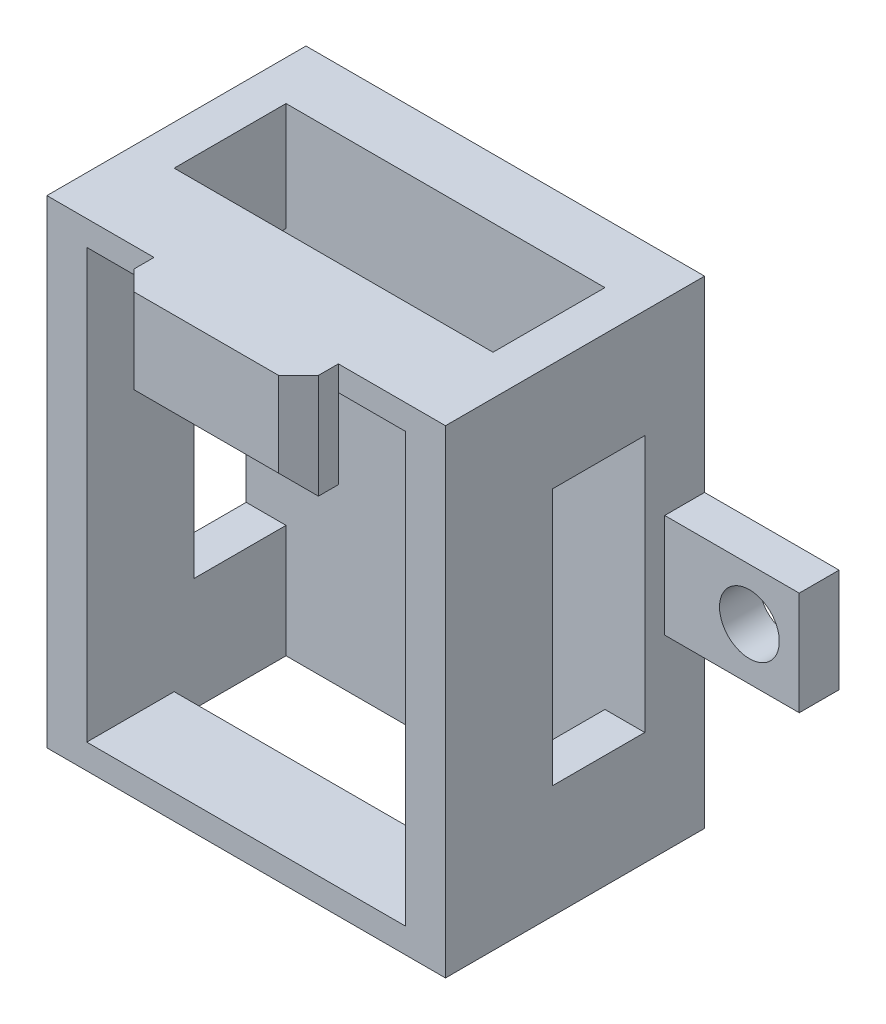
ISO-10303-21;
HEADER;
FILE_DESCRIPTION(('STEP AP214'),'2;1');
FILE_NAME('part.step','',(''),(''),'','','');
FILE_SCHEMA(('AUTOMOTIVE_DESIGN { 1 0 10303 214 1 1 1 1 }'));
ENDSEC;
DATA;
#1=APPLICATION_CONTEXT('core data for automotive mechanical design processes');
#2=APPLICATION_PROTOCOL_DEFINITION('international standard','automotive_design',2000,#1);
#3=PRODUCT_CONTEXT('',#1,'mechanical');
#4=PRODUCT('Part','Part','',(#3));
#5=PRODUCT_RELATED_PRODUCT_CATEGORY('part','',(#4));
#6=PRODUCT_DEFINITION_FORMATION('','',#4);
#7=PRODUCT_DEFINITION_CONTEXT('part definition',#1,'design');
#8=PRODUCT_DEFINITION('design','',#6,#7);
#9=PRODUCT_DEFINITION_SHAPE('','',#8);
#10=(LENGTH_UNIT() NAMED_UNIT(*) SI_UNIT(.MILLI.,.METRE.));
#11=(NAMED_UNIT(*) PLANE_ANGLE_UNIT() SI_UNIT($,.RADIAN.));
#12=(NAMED_UNIT(*) SI_UNIT($,.STERADIAN.) SOLID_ANGLE_UNIT());
#13=UNCERTAINTY_MEASURE_WITH_UNIT(LENGTH_MEASURE(1.E-05),#10,'distance_accuracy_value','');
#14=(GEOMETRIC_REPRESENTATION_CONTEXT(3) GLOBAL_UNCERTAINTY_ASSIGNED_CONTEXT((#13)) GLOBAL_UNIT_ASSIGNED_CONTEXT((#10,
#11,#12)) REPRESENTATION_CONTEXT('',''));
#15=CARTESIAN_POINT('',(0.,0.,0.));
#16=DIRECTION('',(0.,0.,1.));
#17=DIRECTION('',(1.,0.,0.));
#18=AXIS2_PLACEMENT_3D('',#15,#16,#17);
#19=CARTESIAN_POINT('',(10.,12.,3.));
#20=DIRECTION('',(-1.,0.,0.));
#21=DIRECTION('',(0.,-1.,0.));
#22=AXIS2_PLACEMENT_3D('',#19,#20,#21);
#23=PLANE('',#22);
#24=DIRECTION('',(0.,0.,-1.));
#25=VECTOR('',#24,1.);
#26=CARTESIAN_POINT('',(10.,-2.6,2.));
#27=LINE('',#26,#25);
#28=CARTESIAN_POINT('',(10.,-2.6,2.));
#29=VERTEX_POINT('',#28);
#30=CARTESIAN_POINT('',(10.,-2.6,0.));
#31=VERTEX_POINT('',#30);
#32=EDGE_CURVE('E434',#29,#31,#27,.T.);
#33=ORIENTED_EDGE('',*,*,#32,.F.);
#34=DIRECTION('',(0.,-1.,0.));
#35=VECTOR('',#34,1.);
#36=CARTESIAN_POINT('',(10.,0.,2.));
#37=LINE('',#36,#35);
#38=CARTESIAN_POINT('',(10.,2.6,2.));
#39=VERTEX_POINT('',#38);
#40=EDGE_CURVE('E408',#39,#29,#37,.T.);
#41=ORIENTED_EDGE('',*,*,#40,.F.);
#42=DIRECTION('',(0.,0.,-1.));
#43=VECTOR('',#42,1.);
#44=CARTESIAN_POINT('',(10.,2.6,2.));
#45=LINE('',#44,#43);
#46=CARTESIAN_POINT('',(10.,2.6,0.));
#47=VERTEX_POINT('',#46);
#48=EDGE_CURVE('E429',#39,#47,#45,.T.);
#49=ORIENTED_EDGE('',*,*,#48,.T.);
#50=DIRECTION('',(0.,1.,0.));
#51=VECTOR('',#50,1.);
#52=CARTESIAN_POINT('',(10.,12.,0.));
#53=LINE('',#52,#51);
#54=CARTESIAN_POINT('',(10.,12.,0.));
#55=VERTEX_POINT('',#54);
#56=EDGE_CURVE('E575',#47,#55,#53,.T.);
#57=ORIENTED_EDGE('',*,*,#56,.T.);
#58=DIRECTION('',(0.,0.,-1.));
#59=VECTOR('',#58,1.);
#60=CARTESIAN_POINT('',(10.,12.,3.));
#61=LINE('',#60,#59);
#62=CARTESIAN_POINT('',(10.,12.,13.));
#63=VERTEX_POINT('',#62);
#64=EDGE_CURVE('E603',#63,#55,#61,.T.);
#65=ORIENTED_EDGE('',*,*,#64,.F.);
#66=DIRECTION('',(0.,1.,0.));
#67=VECTOR('',#66,1.);
#68=CARTESIAN_POINT('',(10.,12.,13.));
#69=LINE('',#68,#67);
#70=CARTESIAN_POINT('',(10.,-12.,13.));
#71=VERTEX_POINT('',#70);
#72=EDGE_CURVE('E558',#71,#63,#69,.T.);
#73=ORIENTED_EDGE('',*,*,#72,.F.);
#74=DIRECTION('',(0.,0.,-1.));
#75=VECTOR('',#74,1.);
#76=CARTESIAN_POINT('',(10.,-12.,3.));
#77=LINE('',#76,#75);
#78=CARTESIAN_POINT('',(10.,-12.,0.));
#79=VERTEX_POINT('',#78);
#80=EDGE_CURVE('E591',#71,#79,#77,.T.);
#81=ORIENTED_EDGE('',*,*,#80,.T.);
#82=EDGE_CURVE('E576',#79,#31,#53,.T.);
#83=ORIENTED_EDGE('',*,*,#82,.T.);
#84=EDGE_LOOP('',(#33,#41,#49,#57,#65,#73,#81,#83));
#85=FACE_BOUND('',#84,.T.);
#86=DIRECTION('',(0.,-1.,0.));
#87=VECTOR('',#86,1.);
#88=CARTESIAN_POINT('',(10.,12.,7.61998545328169));
#89=LINE('',#88,#87);
#90=CARTESIAN_POINT('',(10.,6.56975597533815,7.61998545328169));
#91=VERTEX_POINT('',#90);
#92=CARTESIAN_POINT('',(10.,-6.32982024783857,7.61998545328169));
#93=VERTEX_POINT('',#92);
#94=EDGE_CURVE('E347',#91,#93,#89,.T.);
#95=ORIENTED_EDGE('',*,*,#94,.F.);
#96=DIRECTION('',(0.,0.,1.));
#97=VECTOR('',#96,1.);
#98=CARTESIAN_POINT('',(10.,6.56975597533815,3.));
#99=LINE('',#98,#97);
#100=CARTESIAN_POINT('',(10.,6.56975597533815,3.));
#101=VERTEX_POINT('',#100);
#102=EDGE_CURVE('E326',#101,#91,#99,.T.);
#103=ORIENTED_EDGE('',*,*,#102,.F.);
#104=DIRECTION('',(0.,-1.,0.));
#105=VECTOR('',#104,1.);
#106=CARTESIAN_POINT('',(10.,12.,3.));
#107=LINE('',#106,#105);
#108=CARTESIAN_POINT('',(10.,-6.32982024783857,3.));
#109=VERTEX_POINT('',#108);
#110=EDGE_CURVE('E339',#101,#109,#107,.T.);
#111=ORIENTED_EDGE('',*,*,#110,.T.);
#112=DIRECTION('',(0.,0.,1.));
#113=VECTOR('',#112,1.);
#114=CARTESIAN_POINT('',(10.,-6.32982024783857,3.));
#115=LINE('',#114,#113);
#116=EDGE_CURVE('E335',#109,#93,#115,.T.);
#117=ORIENTED_EDGE('',*,*,#116,.T.);
#118=EDGE_LOOP('',(#95,#103,#111,#117));
#119=FACE_BOUND('',#118,.T.);
#120=ADVANCED_FACE('F48',(#85,#119),#23,.F.);
#121=CARTESIAN_POINT('',(-10.,12.,3.));
#122=DIRECTION('',(1.,0.,0.));
#123=DIRECTION('',(0.,1.,0.));
#124=AXIS2_PLACEMENT_3D('',#121,#122,#123);
#125=PLANE('',#124);
#126=DIRECTION('',(0.,0.,-1.));
#127=VECTOR('',#126,1.);
#128=CARTESIAN_POINT('',(-10.,2.6,2.));
#129=LINE('',#128,#127);
#130=CARTESIAN_POINT('',(-10.,2.6,2.));
#131=VERTEX_POINT('',#130);
#132=CARTESIAN_POINT('',(-10.,2.6,0.));
#133=VERTEX_POINT('',#132);
#134=EDGE_CURVE('E462',#131,#133,#129,.T.);
#135=ORIENTED_EDGE('',*,*,#134,.F.);
#136=DIRECTION('',(0.,1.,0.));
#137=VECTOR('',#136,1.);
#138=CARTESIAN_POINT('',(-10.,0.,2.));
#139=LINE('',#138,#137);
#140=CARTESIAN_POINT('',(-10.,-2.6,2.));
#141=VERTEX_POINT('',#140);
#142=EDGE_CURVE('E447',#141,#131,#139,.T.);
#143=ORIENTED_EDGE('',*,*,#142,.F.);
#144=DIRECTION('',(0.,0.,-1.));
#145=VECTOR('',#144,1.);
#146=CARTESIAN_POINT('',(-10.,-2.6,2.));
#147=LINE('',#146,#145);
#148=CARTESIAN_POINT('',(-10.,-2.6,0.));
#149=VERTEX_POINT('',#148);
#150=EDGE_CURVE('E483',#141,#149,#147,.T.);
#151=ORIENTED_EDGE('',*,*,#150,.T.);
#152=DIRECTION('',(0.,-1.,0.));
#153=VECTOR('',#152,1.);
#154=CARTESIAN_POINT('',(-10.,12.,0.));
#155=LINE('',#154,#153);
#156=CARTESIAN_POINT('',(-10.,-12.,0.));
#157=VERTEX_POINT('',#156);
#158=EDGE_CURVE('E583',#149,#157,#155,.T.);
#159=ORIENTED_EDGE('',*,*,#158,.T.);
#160=DIRECTION('',(0.,0.,-1.));
#161=VECTOR('',#160,1.);
#162=CARTESIAN_POINT('',(-10.,-12.,3.));
#163=LINE('',#162,#161);
#164=CARTESIAN_POINT('',(-10.,-12.,13.));
#165=VERTEX_POINT('',#164);
#166=EDGE_CURVE('E595',#165,#157,#163,.T.);
#167=ORIENTED_EDGE('',*,*,#166,.F.);
#168=DIRECTION('',(0.,-1.,0.));
#169=VECTOR('',#168,1.);
#170=CARTESIAN_POINT('',(-10.,12.,13.));
#171=LINE('',#170,#169);
#172=CARTESIAN_POINT('',(-10.,12.,13.));
#173=VERTEX_POINT('',#172);
#174=EDGE_CURVE('E567',#173,#165,#171,.T.);
#175=ORIENTED_EDGE('',*,*,#174,.F.);
#176=DIRECTION('',(0.,0.,-1.));
#177=VECTOR('',#176,1.);
#178=CARTESIAN_POINT('',(-10.,12.,3.));
#179=LINE('',#178,#177);
#180=CARTESIAN_POINT('',(-10.,12.,0.));
#181=VERTEX_POINT('',#180);
#182=EDGE_CURVE('E599',#173,#181,#179,.T.);
#183=ORIENTED_EDGE('',*,*,#182,.T.);
#184=EDGE_CURVE('E584',#181,#133,#155,.T.);
#185=ORIENTED_EDGE('',*,*,#184,.T.);
#186=EDGE_LOOP('',(#135,#143,#151,#159,#167,#175,#183,#185));
#187=FACE_BOUND('',#186,.T.);
#188=DIRECTION('',(0.,-1.,0.));
#189=VECTOR('',#188,1.);
#190=CARTESIAN_POINT('',(-10.,0.,7.61998545328169));
#191=LINE('',#190,#189);
#192=CARTESIAN_POINT('',(-10.,6.56975597533815,7.61998545328169));
#193=VERTEX_POINT('',#192);
#194=CARTESIAN_POINT('',(-10.,-6.32982024783857,7.61998545328169));
#195=VERTEX_POINT('',#194);
#196=EDGE_CURVE('E73',#193,#195,#191,.T.);
#197=ORIENTED_EDGE('',*,*,#196,.T.);
#198=DIRECTION('',(0.,0.,1.));
#199=VECTOR('',#198,1.);
#200=CARTESIAN_POINT('',(-10.,-6.32982024783857,0.));
#201=LINE('',#200,#199);
#202=CARTESIAN_POINT('',(-10.,-6.32982024783857,3.));
#203=VERTEX_POINT('',#202);
#204=EDGE_CURVE('E302',#203,#195,#201,.T.);
#205=ORIENTED_EDGE('',*,*,#204,.F.);
#206=DIRECTION('',(0.,-1.,0.));
#207=VECTOR('',#206,1.);
#208=CARTESIAN_POINT('',(-10.,0.,3.));
#209=LINE('',#208,#207);
#210=CARTESIAN_POINT('',(-10.,6.56975597533815,3.));
#211=VERTEX_POINT('',#210);
#212=EDGE_CURVE('E284',#211,#203,#209,.T.);
#213=ORIENTED_EDGE('',*,*,#212,.F.);
#214=DIRECTION('',(0.,0.,1.));
#215=VECTOR('',#214,1.);
#216=CARTESIAN_POINT('',(-10.,6.56975597533815,0.));
#217=LINE('',#216,#215);
#218=EDGE_CURVE('E294',#211,#193,#217,.T.);
#219=ORIENTED_EDGE('',*,*,#218,.T.);
#220=EDGE_LOOP('',(#197,#205,#213,#219));
#221=FACE_BOUND('',#220,.T.);
#222=ADVANCED_FACE('F300',(#187,#221),#125,.F.);
#223=CARTESIAN_POINT('',(-10.,12.,3.));
#224=DIRECTION('',(0.,-1.,0.));
#225=DIRECTION('',(0.,0.,-1.));
#226=AXIS2_PLACEMENT_3D('',#223,#224,#225);
#227=PLANE('',#226);
#228=DIRECTION('',(0.,0.,1.));
#229=VECTOR('',#228,1.);
#230=CARTESIAN_POINT('',(8.,12.,3.));
#231=LINE('',#230,#229);
#232=CARTESIAN_POINT('',(8.,12.,3.));
#233=VERTEX_POINT('',#232);
#234=CARTESIAN_POINT('',(8.,12.,8.61586219333535));
#235=VERTEX_POINT('',#234);
#236=EDGE_CURVE('E370',#233,#235,#231,.T.);
#237=ORIENTED_EDGE('',*,*,#236,.T.);
#238=DIRECTION('',(1.,0.,0.));
#239=VECTOR('',#238,1.);
#240=CARTESIAN_POINT('',(-8.,12.,8.61586219333535));
#241=LINE('',#240,#239);
#242=CARTESIAN_POINT('',(-8.,12.,8.61586219333535));
#243=VERTEX_POINT('',#242);
#244=EDGE_CURVE('E350',#243,#235,#241,.T.);
#245=ORIENTED_EDGE('',*,*,#244,.F.);
#246=DIRECTION('',(0.,0.,1.));
#247=VECTOR('',#246,1.);
#248=CARTESIAN_POINT('',(-8.,12.,3.));
#249=LINE('',#248,#247);
#250=CARTESIAN_POINT('',(-8.,12.,3.));
#251=VERTEX_POINT('',#250);
#252=EDGE_CURVE('E356',#251,#243,#249,.T.);
#253=ORIENTED_EDGE('',*,*,#252,.F.);
#254=DIRECTION('',(1.,0.,0.));
#255=VECTOR('',#254,1.);
#256=CARTESIAN_POINT('',(-8.,12.,3.));
#257=LINE('',#256,#255);
#258=EDGE_CURVE('E374',#251,#233,#257,.T.);
#259=ORIENTED_EDGE('',*,*,#258,.T.);
#260=EDGE_LOOP('',(#237,#245,#253,#259));
#261=FACE_BOUND('',#260,.T.);
#262=DIRECTION('',(-1.,0.,0.));
#263=VECTOR('',#262,1.);
#264=CARTESIAN_POINT('',(-4.625,12.,15.));
#265=LINE('',#264,#263);
#266=CARTESIAN_POINT('',(3.625,12.,15.));
#267=VERTEX_POINT('',#266);
#268=CARTESIAN_POINT('',(-3.625,12.,15.));
#269=VERTEX_POINT('',#268);
#270=EDGE_CURVE('E489',#267,#269,#265,.T.);
#271=ORIENTED_EDGE('',*,*,#270,.F.);
#272=DIRECTION('',(0.707106781186546,0.,-0.707106781186549));
#273=VECTOR('',#272,1.);
#274=CARTESIAN_POINT('',(3.625,12.,15.));
#275=LINE('',#274,#273);
#276=CARTESIAN_POINT('',(4.625,12.,14.));
#277=VERTEX_POINT('',#276);
#278=EDGE_CURVE('E620',#267,#277,#275,.T.);
#279=ORIENTED_EDGE('',*,*,#278,.T.);
#280=DIRECTION('',(0.,0.,-1.));
#281=VECTOR('',#280,1.);
#282=CARTESIAN_POINT('',(4.625,12.,15.));
#283=LINE('',#282,#281);
#284=CARTESIAN_POINT('',(4.625,12.,13.));
#285=VERTEX_POINT('',#284);
#286=EDGE_CURVE('E510',#277,#285,#283,.T.);
#287=ORIENTED_EDGE('',*,*,#286,.T.);
#288=DIRECTION('',(-1.,0.,0.));
#289=VECTOR('',#288,1.);
#290=CARTESIAN_POINT('',(-10.,12.,13.));
#291=LINE('',#290,#289);
#292=EDGE_CURVE('E563',#63,#285,#291,.T.);
#293=ORIENTED_EDGE('',*,*,#292,.F.);
#294=ORIENTED_EDGE('',*,*,#64,.T.);
#295=DIRECTION('',(-1.,0.,0.));
#296=VECTOR('',#295,1.);
#297=CARTESIAN_POINT('',(-10.,12.,0.));
#298=LINE('',#297,#296);
#299=EDGE_CURVE('E580',#55,#181,#298,.T.);
#300=ORIENTED_EDGE('',*,*,#299,.T.);
#301=ORIENTED_EDGE('',*,*,#182,.F.);
#302=CARTESIAN_POINT('',(-4.625,12.,13.));
#303=VERTEX_POINT('',#302);
#304=EDGE_CURVE('E562',#303,#173,#291,.T.);
#305=ORIENTED_EDGE('',*,*,#304,.F.);
#306=DIRECTION('',(0.,0.,-1.));
#307=VECTOR('',#306,1.);
#308=CARTESIAN_POINT('',(-4.625,12.,15.));
#309=LINE('',#308,#307);
#310=CARTESIAN_POINT('',(-4.625,12.,14.));
#311=VERTEX_POINT('',#310);
#312=EDGE_CURVE('E493',#311,#303,#309,.T.);
#313=ORIENTED_EDGE('',*,*,#312,.F.);
#314=DIRECTION('',(0.707106781186546,0.,0.707106781186549));
#315=VECTOR('',#314,1.);
#316=CARTESIAN_POINT('',(-3.625,12.,15.));
#317=LINE('',#316,#315);
#318=EDGE_CURVE('E617',#311,#269,#317,.T.);
#319=ORIENTED_EDGE('',*,*,#318,.T.);
#320=EDGE_LOOP('',(#271,#279,#287,#293,#294,#300,#301,#305,#313,#319));
#321=FACE_BOUND('',#320,.T.);
#322=ADVANCED_FACE('F765',(#261,#321),#227,.F.);
#323=CARTESIAN_POINT('',(-10.,-12.,3.));
#324=DIRECTION('',(0.,1.,0.));
#325=DIRECTION('',(0.,0.,1.));
#326=AXIS2_PLACEMENT_3D('',#323,#324,#325);
#327=PLANE('',#326);
#328=DIRECTION('',(0.,0.,1.));
#329=VECTOR('',#328,1.);
#330=CARTESIAN_POINT('',(-8.,-12.,3.));
#331=LINE('',#330,#329);
#332=CARTESIAN_POINT('',(-8.,-12.,3.));
#333=VERTEX_POINT('',#332);
#334=CARTESIAN_POINT('',(-8.,-12.,8.61586219333535));
#335=VERTEX_POINT('',#334);
#336=EDGE_CURVE('E363',#333,#335,#331,.T.);
#337=ORIENTED_EDGE('',*,*,#336,.T.);
#338=DIRECTION('',(1.,0.,0.));
#339=VECTOR('',#338,1.);
#340=CARTESIAN_POINT('',(-8.,-12.,8.61586219333535));
#341=LINE('',#340,#339);
#342=CARTESIAN_POINT('',(8.,-12.,8.61586219333535));
#343=VERTEX_POINT('',#342);
#344=EDGE_CURVE('E351',#335,#343,#341,.T.);
#345=ORIENTED_EDGE('',*,*,#344,.T.);
#346=DIRECTION('',(0.,0.,1.));
#347=VECTOR('',#346,1.);
#348=CARTESIAN_POINT('',(8.,-12.,3.));
#349=LINE('',#348,#347);
#350=CARTESIAN_POINT('',(8.,-12.,3.));
#351=VERTEX_POINT('',#350);
#352=EDGE_CURVE('E355',#351,#343,#349,.T.);
#353=ORIENTED_EDGE('',*,*,#352,.F.);
#354=DIRECTION('',(1.,0.,0.));
#355=VECTOR('',#354,1.);
#356=CARTESIAN_POINT('',(-8.,-12.,3.));
#357=LINE('',#356,#355);
#358=EDGE_CURVE('E359',#333,#351,#357,.T.);
#359=ORIENTED_EDGE('',*,*,#358,.F.);
#360=EDGE_LOOP('',(#337,#345,#353,#359));
#361=FACE_BOUND('',#360,.T.);
#362=DIRECTION('',(1.,0.,0.));
#363=VECTOR('',#362,1.);
#364=CARTESIAN_POINT('',(-10.,-12.,0.));
#365=LINE('',#364,#363);
#366=EDGE_CURVE('E588',#157,#79,#365,.T.);
#367=ORIENTED_EDGE('',*,*,#366,.T.);
#368=ORIENTED_EDGE('',*,*,#80,.F.);
#369=DIRECTION('',(1.,0.,0.));
#370=VECTOR('',#369,1.);
#371=CARTESIAN_POINT('',(-10.,-12.,13.));
#372=LINE('',#371,#370);
#373=EDGE_CURVE('E571',#165,#71,#372,.T.);
#374=ORIENTED_EDGE('',*,*,#373,.F.);
#375=ORIENTED_EDGE('',*,*,#166,.T.);
#376=EDGE_LOOP('',(#367,#368,#374,#375));
#377=FACE_BOUND('',#376,.T.);
#378=ADVANCED_FACE('F719',(#361,#377),#327,.F.);
#379=CARTESIAN_POINT('',(0.,0.,0.));
#380=DIRECTION('',(0.,0.,1.));
#381=DIRECTION('',(1.,0.,0.));
#382=AXIS2_PLACEMENT_3D('',#379,#380,#381);
#383=PLANE('',#382);
#384=ORIENTED_EDGE('',*,*,#82,.F.);
#385=ORIENTED_EDGE('',*,*,#366,.F.);
#386=ORIENTED_EDGE('',*,*,#158,.F.);
#387=DIRECTION('',(-1.,0.,0.));
#388=VECTOR('',#387,1.);
#389=CARTESIAN_POINT('',(0.,-2.6,0.));
#390=LINE('',#389,#388);
#391=CARTESIAN_POINT('',(-16.75,-2.6,0.));
#392=VERTEX_POINT('',#391);
#393=EDGE_CURVE('E466',#149,#392,#390,.T.);
#394=ORIENTED_EDGE('',*,*,#393,.T.);
#395=DIRECTION('',(0.,-1.,0.));
#396=VECTOR('',#395,1.);
#397=CARTESIAN_POINT('',(-16.75,0.,0.));
#398=LINE('',#397,#396);
#399=CARTESIAN_POINT('',(-16.75,2.6,0.));
#400=VERTEX_POINT('',#399);
#401=EDGE_CURVE('E470',#400,#392,#398,.T.);
#402=ORIENTED_EDGE('',*,*,#401,.F.);
#403=DIRECTION('',(-1.,0.,0.));
#404=VECTOR('',#403,1.);
#405=CARTESIAN_POINT('',(0.,2.6,0.));
#406=LINE('',#405,#404);
#407=EDGE_CURVE('E391',#133,#400,#406,.T.);
#408=ORIENTED_EDGE('',*,*,#407,.F.);
#409=ORIENTED_EDGE('',*,*,#184,.F.);
#410=ORIENTED_EDGE('',*,*,#299,.F.);
#411=ORIENTED_EDGE('',*,*,#56,.F.);
#412=DIRECTION('',(1.,0.,0.));
#413=VECTOR('',#412,1.);
#414=CARTESIAN_POINT('',(0.,2.6,0.));
#415=LINE('',#414,#413);
#416=CARTESIAN_POINT('',(16.75,2.6,0.));
#417=VERTEX_POINT('',#416);
#418=EDGE_CURVE('E417',#47,#417,#415,.T.);
#419=ORIENTED_EDGE('',*,*,#418,.T.);
#420=DIRECTION('',(0.,-1.,0.));
#421=VECTOR('',#420,1.);
#422=CARTESIAN_POINT('',(16.75,0.,0.));
#423=LINE('',#422,#421);
#424=CARTESIAN_POINT('',(16.75,-2.6,0.));
#425=VERTEX_POINT('',#424);
#426=EDGE_CURVE('E422',#417,#425,#423,.T.);
#427=ORIENTED_EDGE('',*,*,#426,.T.);
#428=DIRECTION('',(1.,0.,0.));
#429=VECTOR('',#428,1.);
#430=CARTESIAN_POINT('',(0.,-2.6,0.));
#431=LINE('',#430,#429);
#432=EDGE_CURVE('E397',#31,#425,#431,.T.);
#433=ORIENTED_EDGE('',*,*,#432,.F.);
#434=EDGE_LOOP('',(#384,#385,#386,#394,#402,#408,#409,#410,#411,#419,#427,#433));
#435=FACE_BOUND('',#434,.T.);
#436=CARTESIAN_POINT('',(-14.25,0.,0.));
#437=DIRECTION('',(0.,0.,-1.));
#438=DIRECTION('',(-1.,0.,0.));
#439=AXIS2_PLACEMENT_3D('',#436,#437,#438);
#440=CIRCLE('',#439,1.5);
#441=CARTESIAN_POINT('',(-15.75,0.,0.));
#442=VERTEX_POINT('',#441);
#443=EDGE_CURVE('E448',#442,#442,#440,.F.);
#444=ORIENTED_EDGE('',*,*,#443,.T.);
#445=EDGE_LOOP('',(#444));
#446=FACE_BOUND('',#445,.T.);
#447=CARTESIAN_POINT('',(14.25,0.,0.));
#448=DIRECTION('',(0.,0.,-1.));
#449=DIRECTION('',(-1.,0.,0.));
#450=AXIS2_PLACEMENT_3D('',#447,#448,#449);
#451=CIRCLE('',#450,1.5);
#452=CARTESIAN_POINT('',(12.75,0.,0.));
#453=VERTEX_POINT('',#452);
#454=EDGE_CURVE('E413',#453,#453,#451,.T.);
#455=ORIENTED_EDGE('',*,*,#454,.F.);
#456=EDGE_LOOP('',(#455));
#457=FACE_BOUND('',#456,.T.);
#458=ADVANCED_FACE('F721',(#435,#446,#457),#383,.F.);
#459=CARTESIAN_POINT('',(0.,0.,13.));
#460=DIRECTION('',(0.,0.,1.));
#461=DIRECTION('',(1.,0.,0.));
#462=AXIS2_PLACEMENT_3D('',#459,#460,#461);
#463=PLANE('',#462);
#464=DIRECTION('',(0.,-1.,0.));
#465=VECTOR('',#464,1.);
#466=CARTESIAN_POINT('',(-4.625,12.,13.));
#467=LINE('',#466,#465);
#468=CARTESIAN_POINT('',(-4.625,10.75,13.));
#469=VERTEX_POINT('',#468);
#470=EDGE_CURVE('E495',#303,#469,#467,.T.);
#471=ORIENTED_EDGE('',*,*,#470,.F.);
#472=ORIENTED_EDGE('',*,*,#304,.T.);
#473=ORIENTED_EDGE('',*,*,#174,.T.);
#474=ORIENTED_EDGE('',*,*,#373,.T.);
#475=ORIENTED_EDGE('',*,*,#72,.T.);
#476=ORIENTED_EDGE('',*,*,#292,.T.);
#477=DIRECTION('',(0.,1.,0.));
#478=VECTOR('',#477,1.);
#479=CARTESIAN_POINT('',(4.625,12.,13.));
#480=LINE('',#479,#478);
#481=CARTESIAN_POINT('',(4.625,10.75,13.));
#482=VERTEX_POINT('',#481);
#483=EDGE_CURVE('E507',#482,#285,#480,.T.);
#484=ORIENTED_EDGE('',*,*,#483,.F.);
#485=DIRECTION('',(-1.,0.,0.));
#486=VECTOR('',#485,1.);
#487=CARTESIAN_POINT('',(-8.,10.75,13.));
#488=LINE('',#487,#486);
#489=CARTESIAN_POINT('',(8.,10.75,13.));
#490=VERTEX_POINT('',#489);
#491=EDGE_CURVE('E524',#490,#482,#488,.T.);
#492=ORIENTED_EDGE('',*,*,#491,.F.);
#493=DIRECTION('',(0.,1.,0.));
#494=VECTOR('',#493,1.);
#495=CARTESIAN_POINT('',(8.,-10.75,13.));
#496=LINE('',#495,#494);
#497=CARTESIAN_POINT('',(8.,-10.75,13.));
#498=VERTEX_POINT('',#497);
#499=EDGE_CURVE('E520',#498,#490,#496,.T.);
#500=ORIENTED_EDGE('',*,*,#499,.F.);
#501=DIRECTION('',(1.,0.,0.));
#502=VECTOR('',#501,1.);
#503=CARTESIAN_POINT('',(-8.,-10.75,13.));
#504=LINE('',#503,#502);
#505=CARTESIAN_POINT('',(-8.,-10.75,13.));
#506=VERTEX_POINT('',#505);
#507=EDGE_CURVE('E533',#506,#498,#504,.T.);
#508=ORIENTED_EDGE('',*,*,#507,.F.);
#509=DIRECTION('',(0.,-1.,0.));
#510=VECTOR('',#509,1.);
#511=CARTESIAN_POINT('',(-8.,-10.75,13.));
#512=LINE('',#511,#510);
#513=CARTESIAN_POINT('',(-8.,10.75,13.));
#514=VERTEX_POINT('',#513);
#515=EDGE_CURVE('E528',#514,#506,#512,.T.);
#516=ORIENTED_EDGE('',*,*,#515,.F.);
#517=EDGE_CURVE('E523',#469,#514,#488,.T.);
#518=ORIENTED_EDGE('',*,*,#517,.F.);
#519=EDGE_LOOP('',(#471,#472,#473,#474,#475,#476,#484,#492,#500,#508,#516,#518));
#520=FACE_BOUND('',#519,.T.);
#521=ADVANCED_FACE('F657',(#520),#463,.T.);
#522=CARTESIAN_POINT('',(8.,-10.75,13.));
#523=DIRECTION('',(-1.,0.,0.));
#524=DIRECTION('',(0.,0.,1.));
#525=AXIS2_PLACEMENT_3D('',#522,#523,#524);
#526=PLANE('',#525);
#527=DIRECTION('',(0.,0.,1.));
#528=VECTOR('',#527,1.);
#529=CARTESIAN_POINT('',(8.,-6.32982024783857,13.));
#530=LINE('',#529,#528);
#531=CARTESIAN_POINT('',(8.00000000000001,-6.32982024783857,3.));
#532=VERTEX_POINT('',#531);
#533=CARTESIAN_POINT('',(8.,-6.32982024783857,7.61998545328169));
#534=VERTEX_POINT('',#533);
#535=EDGE_CURVE('E332',#532,#534,#530,.T.);
#536=ORIENTED_EDGE('',*,*,#535,.F.);
#537=DIRECTION('',(0.,1.,0.));
#538=VECTOR('',#537,1.);
#539=CARTESIAN_POINT('',(8.,-10.75,3.));
#540=LINE('',#539,#538);
#541=EDGE_CURVE('E537',#351,#532,#540,.T.);
#542=ORIENTED_EDGE('',*,*,#541,.F.);
#543=ORIENTED_EDGE('',*,*,#352,.T.);
#544=DIRECTION('',(0.,1.,0.));
#545=VECTOR('',#544,1.);
#546=CARTESIAN_POINT('',(8.,-12.,8.61586219333535));
#547=LINE('',#546,#545);
#548=CARTESIAN_POINT('',(8.,-10.75,8.61586219333535));
#549=VERTEX_POINT('',#548);
#550=EDGE_CURVE('E386',#343,#549,#547,.T.);
#551=ORIENTED_EDGE('',*,*,#550,.T.);
#552=DIRECTION('',(0.,0.,-1.));
#553=VECTOR('',#552,1.);
#554=CARTESIAN_POINT('',(8.,-10.75,13.));
#555=LINE('',#554,#553);
#556=EDGE_CURVE('E536',#498,#549,#555,.T.);
#557=ORIENTED_EDGE('',*,*,#556,.F.);
#558=ORIENTED_EDGE('',*,*,#499,.T.);
#559=DIRECTION('',(0.,0.,-1.));
#560=VECTOR('',#559,1.);
#561=CARTESIAN_POINT('',(8.,10.75,13.));
#562=LINE('',#561,#560);
#563=CARTESIAN_POINT('',(8.,10.75,8.61586219333535));
#564=VERTEX_POINT('',#563);
#565=EDGE_CURVE('E554',#490,#564,#562,.T.);
#566=ORIENTED_EDGE('',*,*,#565,.T.);
#567=EDGE_CURVE('E367',#564,#235,#547,.T.);
#568=ORIENTED_EDGE('',*,*,#567,.T.);
#569=ORIENTED_EDGE('',*,*,#236,.F.);
#570=CARTESIAN_POINT('',(8.00000000000001,6.56975597533815,3.));
#571=VERTEX_POINT('',#570);
#572=EDGE_CURVE('E519',#571,#233,#540,.T.);
#573=ORIENTED_EDGE('',*,*,#572,.F.);
#574=DIRECTION('',(0.,0.,1.));
#575=VECTOR('',#574,1.);
#576=CARTESIAN_POINT('',(8.,6.56975597533815,13.));
#577=LINE('',#576,#575);
#578=CARTESIAN_POINT('',(8.,6.56975597533815,7.61998545328169));
#579=VERTEX_POINT('',#578);
#580=EDGE_CURVE('E322',#571,#579,#577,.T.);
#581=ORIENTED_EDGE('',*,*,#580,.T.);
#582=DIRECTION('',(0.,-1.,0.));
#583=VECTOR('',#582,1.);
#584=CARTESIAN_POINT('',(8.,-10.75,7.61998545328169));
#585=LINE('',#584,#583);
#586=EDGE_CURVE('E343',#579,#534,#585,.T.);
#587=ORIENTED_EDGE('',*,*,#586,.T.);
#588=EDGE_LOOP('',(#536,#542,#543,#551,#557,#558,#566,#568,#569,#573,#581,#587));
#589=FACE_BOUND('',#588,.T.);
#590=ADVANCED_FACE('F652',(#589),#526,.T.);
#591=CARTESIAN_POINT('',(-8.,10.75,13.));
#592=DIRECTION('',(0.,-1.,0.));
#593=DIRECTION('',(0.,0.,-1.));
#594=AXIS2_PLACEMENT_3D('',#591,#592,#593);
#595=PLANE('',#594);
#596=DIRECTION('',(-1.,0.,0.));
#597=VECTOR('',#596,1.);
#598=CARTESIAN_POINT('',(-8.,10.75,8.61586219333535));
#599=LINE('',#598,#597);
#600=CARTESIAN_POINT('',(-8.,10.75,8.61586219333535));
#601=VERTEX_POINT('',#600);
#602=EDGE_CURVE('E384',#564,#601,#599,.T.);
#603=ORIENTED_EDGE('',*,*,#602,.F.);
#604=ORIENTED_EDGE('',*,*,#565,.F.);
#605=ORIENTED_EDGE('',*,*,#491,.T.);
#606=EDGE_CURVE('E529',#482,#469,#488,.T.);
#607=ORIENTED_EDGE('',*,*,#606,.T.);
#608=ORIENTED_EDGE('',*,*,#517,.T.);
#609=DIRECTION('',(0.,0.,-1.));
#610=VECTOR('',#609,1.);
#611=CARTESIAN_POINT('',(-8.,10.75,13.));
#612=LINE('',#611,#610);
#613=EDGE_CURVE('E550',#514,#601,#612,.T.);
#614=ORIENTED_EDGE('',*,*,#613,.T.);
#615=EDGE_LOOP('',(#603,#604,#605,#607,#608,#614));
#616=FACE_BOUND('',#615,.T.);
#617=ADVANCED_FACE('F664',(#616),#595,.T.);
#618=CARTESIAN_POINT('',(-8.,-10.75,13.));
#619=DIRECTION('',(1.,0.,0.));
#620=DIRECTION('',(0.,0.,-1.));
#621=AXIS2_PLACEMENT_3D('',#618,#619,#620);
#622=PLANE('',#621);
#623=DIRECTION('',(0.,0.,-1.));
#624=VECTOR('',#623,1.);
#625=CARTESIAN_POINT('',(-8.,-6.32982024783857,13.));
#626=LINE('',#625,#624);
#627=CARTESIAN_POINT('',(-7.99999999999999,-6.32982024783857,7.61998545328169));
#628=VERTEX_POINT('',#627);
#629=CARTESIAN_POINT('',(-7.99999999999999,-6.32982024783857,3.));
#630=VERTEX_POINT('',#629);
#631=EDGE_CURVE('E329',#628,#630,#626,.T.);
#632=ORIENTED_EDGE('',*,*,#631,.F.);
#633=DIRECTION('',(0.,1.,0.));
#634=VECTOR('',#633,1.);
#635=CARTESIAN_POINT('',(-8.,-10.75,7.61998545328169));
#636=LINE('',#635,#634);
#637=CARTESIAN_POINT('',(-7.99999999999999,6.56975597533815,7.61998545328169));
#638=VERTEX_POINT('',#637);
#639=EDGE_CURVE('E11',#628,#638,#636,.T.);
#640=ORIENTED_EDGE('',*,*,#639,.T.);
#641=DIRECTION('',(0.,0.,-1.));
#642=VECTOR('',#641,1.);
#643=CARTESIAN_POINT('',(-8.,6.56975597533815,13.));
#644=LINE('',#643,#642);
#645=CARTESIAN_POINT('',(-8.,6.56975597533815,3.));
#646=VERTEX_POINT('',#645);
#647=EDGE_CURVE('E319',#638,#646,#644,.T.);
#648=ORIENTED_EDGE('',*,*,#647,.T.);
#649=DIRECTION('',(0.,-1.,0.));
#650=VECTOR('',#649,1.);
#651=CARTESIAN_POINT('',(-8.,-10.75,3.));
#652=LINE('',#651,#650);
#653=EDGE_CURVE('E287',#251,#646,#652,.T.);
#654=ORIENTED_EDGE('',*,*,#653,.F.);
#655=ORIENTED_EDGE('',*,*,#252,.T.);
#656=DIRECTION('',(0.,1.,0.));
#657=VECTOR('',#656,1.);
#658=CARTESIAN_POINT('',(-8.,-12.,8.61586219333535));
#659=LINE('',#658,#657);
#660=EDGE_CURVE('E385',#601,#243,#659,.T.);
#661=ORIENTED_EDGE('',*,*,#660,.F.);
#662=ORIENTED_EDGE('',*,*,#613,.F.);
#663=ORIENTED_EDGE('',*,*,#515,.T.);
#664=DIRECTION('',(0.,0.,-1.));
#665=VECTOR('',#664,1.);
#666=CARTESIAN_POINT('',(-8.,-10.75,13.));
#667=LINE('',#666,#665);
#668=CARTESIAN_POINT('',(-8.,-10.75,8.61586219333535));
#669=VERTEX_POINT('',#668);
#670=EDGE_CURVE('E546',#506,#669,#667,.T.);
#671=ORIENTED_EDGE('',*,*,#670,.T.);
#672=EDGE_CURVE('E381',#335,#669,#659,.T.);
#673=ORIENTED_EDGE('',*,*,#672,.F.);
#674=ORIENTED_EDGE('',*,*,#336,.F.);
#675=EDGE_CURVE('E540',#630,#333,#652,.T.);
#676=ORIENTED_EDGE('',*,*,#675,.F.);
#677=EDGE_LOOP('',(#632,#640,#648,#654,#655,#661,#662,#663,#671,#673,#674,#676));
#678=FACE_BOUND('',#677,.T.);
#679=ADVANCED_FACE('F855',(#678),#622,.T.);
#680=CARTESIAN_POINT('',(-8.,-10.75,13.));
#681=DIRECTION('',(0.,1.,0.));
#682=DIRECTION('',(0.,0.,1.));
#683=AXIS2_PLACEMENT_3D('',#680,#681,#682);
#684=PLANE('',#683);
#685=DIRECTION('',(1.,0.,0.));
#686=VECTOR('',#685,1.);
#687=CARTESIAN_POINT('',(-8.,-10.75,8.61586219333535));
#688=LINE('',#687,#686);
#689=EDGE_CURVE('E58',#669,#549,#688,.T.);
#690=ORIENTED_EDGE('',*,*,#689,.F.);
#691=ORIENTED_EDGE('',*,*,#670,.F.);
#692=ORIENTED_EDGE('',*,*,#507,.T.);
#693=ORIENTED_EDGE('',*,*,#556,.T.);
#694=EDGE_LOOP('',(#690,#691,#692,#693));
#695=FACE_BOUND('',#694,.T.);
#696=ADVANCED_FACE('F647',(#695),#684,.T.);
#697=CARTESIAN_POINT('',(0.,0.,3.));
#698=DIRECTION('',(0.,0.,1.));
#699=DIRECTION('',(1.,0.,0.));
#700=AXIS2_PLACEMENT_3D('',#697,#698,#699);
#701=PLANE('',#700);
#702=ORIENTED_EDGE('',*,*,#541,.T.);
#703=DIRECTION('',(-1.,0.,0.));
#704=VECTOR('',#703,1.);
#705=CARTESIAN_POINT('',(16.75,-6.32982024783857,3.));
#706=LINE('',#705,#704);
#707=EDGE_CURVE('E313',#109,#532,#706,.T.);
#708=ORIENTED_EDGE('',*,*,#707,.F.);
#709=ORIENTED_EDGE('',*,*,#110,.F.);
#710=DIRECTION('',(-1.,0.,0.));
#711=VECTOR('',#710,1.);
#712=CARTESIAN_POINT('',(16.75,6.56975597533815,3.));
#713=LINE('',#712,#711);
#714=EDGE_CURVE('E65',#101,#571,#713,.T.);
#715=ORIENTED_EDGE('',*,*,#714,.T.);
#716=ORIENTED_EDGE('',*,*,#572,.T.);
#717=ORIENTED_EDGE('',*,*,#258,.F.);
#718=ORIENTED_EDGE('',*,*,#653,.T.);
#719=EDGE_CURVE('E278',#646,#211,#713,.T.);
#720=ORIENTED_EDGE('',*,*,#719,.T.);
#721=ORIENTED_EDGE('',*,*,#212,.T.);
#722=EDGE_CURVE('E314',#630,#203,#706,.T.);
#723=ORIENTED_EDGE('',*,*,#722,.F.);
#724=ORIENTED_EDGE('',*,*,#675,.T.);
#725=ORIENTED_EDGE('',*,*,#358,.T.);
#726=EDGE_LOOP('',(#702,#708,#709,#715,#716,#717,#718,#720,#721,#723,#724,#725));
#727=FACE_BOUND('',#726,.T.);
#728=ADVANCED_FACE('F281',(#727),#701,.T.);
#729=CARTESIAN_POINT('',(-4.625,12.,15.));
#730=DIRECTION('',(1.,0.,0.));
#731=DIRECTION('',(0.,1.,0.));
#732=AXIS2_PLACEMENT_3D('',#729,#730,#731);
#733=PLANE('',#732);
#734=DIRECTION('',(0.,0.,-1.));
#735=VECTOR('',#734,1.);
#736=CARTESIAN_POINT('',(-4.625,6.75,15.));
#737=LINE('',#736,#735);
#738=CARTESIAN_POINT('',(-4.625,6.75,14.));
#739=VERTEX_POINT('',#738);
#740=CARTESIAN_POINT('',(-4.625,6.75,13.));
#741=VERTEX_POINT('',#740);
#742=EDGE_CURVE('E516',#739,#741,#737,.T.);
#743=ORIENTED_EDGE('',*,*,#742,.F.);
#744=DIRECTION('',(0.,1.,0.));
#745=VECTOR('',#744,1.);
#746=CARTESIAN_POINT('',(-4.625,12.,14.));
#747=LINE('',#746,#745);
#748=EDGE_CURVE('E626',#739,#311,#747,.T.);
#749=ORIENTED_EDGE('',*,*,#748,.T.);
#750=ORIENTED_EDGE('',*,*,#312,.T.);
#751=ORIENTED_EDGE('',*,*,#470,.T.);
#752=EDGE_CURVE('E500',#469,#741,#467,.T.);
#753=ORIENTED_EDGE('',*,*,#752,.T.);
#754=EDGE_LOOP('',(#743,#749,#750,#751,#753));
#755=FACE_BOUND('',#754,.T.);
#756=ADVANCED_FACE('F683',(#755),#733,.F.);
#757=CARTESIAN_POINT('',(-4.625,6.75,15.));
#758=DIRECTION('',(0.,1.,0.));
#759=DIRECTION('',(0.,0.,1.));
#760=AXIS2_PLACEMENT_3D('',#757,#758,#759);
#761=PLANE('',#760);
#762=DIRECTION('',(0.,0.,-1.));
#763=VECTOR('',#762,1.);
#764=CARTESIAN_POINT('',(4.625,6.75,15.));
#765=LINE('',#764,#763);
#766=CARTESIAN_POINT('',(4.625,6.75,14.));
#767=VERTEX_POINT('',#766);
#768=CARTESIAN_POINT('',(4.625,6.75,13.));
#769=VERTEX_POINT('',#768);
#770=EDGE_CURVE('E513',#767,#769,#765,.T.);
#771=ORIENTED_EDGE('',*,*,#770,.F.);
#772=DIRECTION('',(-1.,0.,0.));
#773=VECTOR('',#772,1.);
#774=CARTESIAN_POINT('',(-4.625,6.75,14.));
#775=LINE('',#774,#773);
#776=EDGE_CURVE('E629',#767,#739,#775,.T.);
#777=ORIENTED_EDGE('',*,*,#776,.T.);
#778=ORIENTED_EDGE('',*,*,#742,.T.);
#779=DIRECTION('',(1.,0.,0.));
#780=VECTOR('',#779,1.);
#781=CARTESIAN_POINT('',(-4.625,6.75,13.));
#782=LINE('',#781,#780);
#783=EDGE_CURVE('E499',#741,#769,#782,.T.);
#784=ORIENTED_EDGE('',*,*,#783,.T.);
#785=EDGE_LOOP('',(#771,#777,#778,#784));
#786=FACE_BOUND('',#785,.T.);
#787=ADVANCED_FACE('F679',(#786),#761,.F.);
#788=CARTESIAN_POINT('',(4.625,12.,15.));
#789=DIRECTION('',(-1.,0.,0.));
#790=DIRECTION('',(0.,-1.,0.));
#791=AXIS2_PLACEMENT_3D('',#788,#789,#790);
#792=PLANE('',#791);
#793=ORIENTED_EDGE('',*,*,#286,.F.);
#794=DIRECTION('',(0.,-1.,0.));
#795=VECTOR('',#794,1.);
#796=CARTESIAN_POINT('',(4.625,6.75,14.));
#797=LINE('',#796,#795);
#798=EDGE_CURVE('E623',#277,#767,#797,.T.);
#799=ORIENTED_EDGE('',*,*,#798,.T.);
#800=ORIENTED_EDGE('',*,*,#770,.T.);
#801=EDGE_CURVE('E494',#769,#482,#480,.T.);
#802=ORIENTED_EDGE('',*,*,#801,.T.);
#803=ORIENTED_EDGE('',*,*,#483,.T.);
#804=EDGE_LOOP('',(#793,#799,#800,#802,#803));
#805=FACE_BOUND('',#804,.T.);
#806=ADVANCED_FACE('F674',(#805),#792,.F.);
#807=CARTESIAN_POINT('',(0.,0.,15.));
#808=DIRECTION('',(0.,0.,1.));
#809=DIRECTION('',(1.,0.,0.));
#810=AXIS2_PLACEMENT_3D('',#807,#808,#809);
#811=PLANE('',#810);
#812=DIRECTION('',(1.,0.,0.));
#813=VECTOR('',#812,1.);
#814=CARTESIAN_POINT('',(4.625,7.75,15.));
#815=LINE('',#814,#813);
#816=CARTESIAN_POINT('',(-3.625,7.75,15.));
#817=VERTEX_POINT('',#816);
#818=CARTESIAN_POINT('',(3.625,7.75,15.));
#819=VERTEX_POINT('',#818);
#820=EDGE_CURVE('E607',#817,#819,#815,.T.);
#821=ORIENTED_EDGE('',*,*,#820,.T.);
#822=DIRECTION('',(0.,1.,0.));
#823=VECTOR('',#822,1.);
#824=CARTESIAN_POINT('',(3.625,12.,15.));
#825=LINE('',#824,#823);
#826=EDGE_CURVE('E613',#819,#267,#825,.T.);
#827=ORIENTED_EDGE('',*,*,#826,.T.);
#828=ORIENTED_EDGE('',*,*,#270,.T.);
#829=DIRECTION('',(0.,-1.,0.));
#830=VECTOR('',#829,1.);
#831=CARTESIAN_POINT('',(-3.625,6.75,15.));
#832=LINE('',#831,#830);
#833=EDGE_CURVE('E610',#269,#817,#832,.T.);
#834=ORIENTED_EDGE('',*,*,#833,.T.);
#835=EDGE_LOOP('',(#821,#827,#828,#834));
#836=FACE_BOUND('',#835,.T.);
#837=ADVANCED_FACE('F792',(#836),#811,.T.);
#838=CARTESIAN_POINT('',(0.,0.,13.));
#839=DIRECTION('',(0.,0.,1.));
#840=DIRECTION('',(1.,0.,0.));
#841=AXIS2_PLACEMENT_3D('',#838,#839,#840);
#842=PLANE('',#841);
#843=ORIENTED_EDGE('',*,*,#606,.F.);
#844=ORIENTED_EDGE('',*,*,#801,.F.);
#845=ORIENTED_EDGE('',*,*,#783,.F.);
#846=ORIENTED_EDGE('',*,*,#752,.F.);
#847=EDGE_LOOP('',(#843,#844,#845,#846));
#848=FACE_BOUND('',#847,.T.);
#849=ADVANCED_FACE('F668',(#848),#842,.F.);
#850=CARTESIAN_POINT('',(-3.625,0.,15.));
#851=DIRECTION('',(-0.707106781186549,0.,0.707106781186546));
#852=DIRECTION('',(0.,1.,0.));
#853=AXIS2_PLACEMENT_3D('',#850,#851,#852);
#854=PLANE('',#853);
#855=ORIENTED_EDGE('',*,*,#318,.F.);
#856=ORIENTED_EDGE('',*,*,#748,.F.);
#857=DIRECTION('',(-0.577350269189625,-0.577350269189625,-0.577350269189627));
#858=VECTOR('',#857,1.);
#859=CARTESIAN_POINT('',(-2.41666666666667,8.95833333333333,16.2083333333333));
#860=LINE('',#859,#858);
#861=EDGE_CURVE('E635',#817,#739,#860,.T.);
#862=ORIENTED_EDGE('',*,*,#861,.F.);
#863=ORIENTED_EDGE('',*,*,#833,.F.);
#864=EDGE_LOOP('',(#855,#856,#862,#863));
#865=FACE_BOUND('',#864,.T.);
#866=ADVANCED_FACE('F51',(#865),#854,.T.);
#867=CARTESIAN_POINT('',(0.,7.75,15.));
#868=DIRECTION('',(0.,-0.707106781186549,0.707106781186546));
#869=DIRECTION('',(-1.,0.,0.));
#870=AXIS2_PLACEMENT_3D('',#867,#868,#869);
#871=PLANE('',#870);
#872=ORIENTED_EDGE('',*,*,#861,.T.);
#873=ORIENTED_EDGE('',*,*,#776,.F.);
#874=DIRECTION('',(-0.577350269189625,0.577350269189625,0.577350269189627));
#875=VECTOR('',#874,1.);
#876=CARTESIAN_POINT('',(2.41666666666667,8.95833333333333,16.2083333333333));
#877=LINE('',#876,#875);
#878=EDGE_CURVE('E433',#819,#767,#877,.F.);
#879=ORIENTED_EDGE('',*,*,#878,.F.);
#880=ORIENTED_EDGE('',*,*,#820,.F.);
#881=EDGE_LOOP('',(#872,#873,#879,#880));
#882=FACE_BOUND('',#881,.T.);
#883=ADVANCED_FACE('F774',(#882),#871,.T.);
#884=CARTESIAN_POINT('',(3.625,0.,15.));
#885=DIRECTION('',(0.707106781186549,0.,0.707106781186546));
#886=DIRECTION('',(0.,-1.,0.));
#887=AXIS2_PLACEMENT_3D('',#884,#885,#886);
#888=PLANE('',#887);
#889=ORIENTED_EDGE('',*,*,#878,.T.);
#890=ORIENTED_EDGE('',*,*,#798,.F.);
#891=ORIENTED_EDGE('',*,*,#278,.F.);
#892=ORIENTED_EDGE('',*,*,#826,.F.);
#893=EDGE_LOOP('',(#889,#890,#891,#892));
#894=FACE_BOUND('',#893,.T.);
#895=ADVANCED_FACE('F756',(#894),#888,.T.);
#896=CARTESIAN_POINT('',(0.,2.6,2.));
#897=DIRECTION('',(0.,-1.,0.));
#898=DIRECTION('',(0.,0.,-1.));
#899=AXIS2_PLACEMENT_3D('',#896,#897,#898);
#900=PLANE('',#899);
#901=ORIENTED_EDGE('',*,*,#407,.T.);
#902=DIRECTION('',(0.,0.,-1.));
#903=VECTOR('',#902,1.);
#904=CARTESIAN_POINT('',(-16.75,2.6,2.));
#905=LINE('',#904,#903);
#906=CARTESIAN_POINT('',(-16.75,2.6,2.));
#907=VERTEX_POINT('',#906);
#908=EDGE_CURVE('E418',#907,#400,#905,.T.);
#909=ORIENTED_EDGE('',*,*,#908,.F.);
#910=DIRECTION('',(-1.,0.,0.));
#911=VECTOR('',#910,1.);
#912=CARTESIAN_POINT('',(0.,2.6,2.));
#913=LINE('',#912,#911);
#914=EDGE_CURVE('E443',#131,#907,#913,.T.);
#915=ORIENTED_EDGE('',*,*,#914,.F.);
#916=ORIENTED_EDGE('',*,*,#134,.T.);
#917=EDGE_LOOP('',(#901,#909,#915,#916));
#918=FACE_BOUND('',#917,.T.);
#919=ADVANCED_FACE('F737',(#918),#900,.F.);
#920=CARTESIAN_POINT('',(-16.75,0.,2.));
#921=DIRECTION('',(1.,0.,0.));
#922=DIRECTION('',(0.,0.,-1.));
#923=AXIS2_PLACEMENT_3D('',#920,#921,#922);
#924=PLANE('',#923);
#925=ORIENTED_EDGE('',*,*,#401,.T.);
#926=DIRECTION('',(0.,0.,-1.));
#927=VECTOR('',#926,1.);
#928=CARTESIAN_POINT('',(-16.75,-2.6,2.));
#929=LINE('',#928,#927);
#930=CARTESIAN_POINT('',(-16.75,-2.6,2.));
#931=VERTEX_POINT('',#930);
#932=EDGE_CURVE('E480',#931,#392,#929,.T.);
#933=ORIENTED_EDGE('',*,*,#932,.F.);
#934=DIRECTION('',(0.,-1.,0.));
#935=VECTOR('',#934,1.);
#936=CARTESIAN_POINT('',(-16.75,0.,2.));
#937=LINE('',#936,#935);
#938=EDGE_CURVE('E455',#907,#931,#937,.T.);
#939=ORIENTED_EDGE('',*,*,#938,.F.);
#940=ORIENTED_EDGE('',*,*,#908,.T.);
#941=EDGE_LOOP('',(#925,#933,#939,#940));
#942=FACE_BOUND('',#941,.T.);
#943=ADVANCED_FACE('F747',(#942),#924,.F.);
#944=CARTESIAN_POINT('',(0.,-2.6,2.));
#945=DIRECTION('',(0.,-1.,0.));
#946=DIRECTION('',(1.,0.,0.));
#947=AXIS2_PLACEMENT_3D('',#944,#945,#946);
#948=PLANE('',#947);
#949=ORIENTED_EDGE('',*,*,#393,.F.);
#950=ORIENTED_EDGE('',*,*,#150,.F.);
#951=DIRECTION('',(-1.,0.,0.));
#952=VECTOR('',#951,1.);
#953=CARTESIAN_POINT('',(0.,-2.6,2.));
#954=LINE('',#953,#952);
#955=EDGE_CURVE('E451',#141,#931,#954,.T.);
#956=ORIENTED_EDGE('',*,*,#955,.T.);
#957=ORIENTED_EDGE('',*,*,#932,.T.);
#958=EDGE_LOOP('',(#949,#950,#956,#957));
#959=FACE_BOUND('',#958,.T.);
#960=ADVANCED_FACE('F745',(#959),#948,.T.);
#961=CARTESIAN_POINT('',(-14.25,0.,2.));
#962=DIRECTION('',(0.,0.,-1.));
#963=DIRECTION('',(-1.,0.,0.));
#964=AXIS2_PLACEMENT_3D('',#961,#962,#963);
#965=CYLINDRICAL_SURFACE('',#964,1.5);
#966=CARTESIAN_POINT('',(-14.25,0.,2.));
#967=DIRECTION('',(0.,0.,-1.));
#968=DIRECTION('',(-1.,0.,0.));
#969=AXIS2_PLACEMENT_3D('',#966,#967,#968);
#970=CIRCLE('',#969,1.5);
#971=CARTESIAN_POINT('',(-15.75,0.,2.));
#972=VERTEX_POINT('',#971);
#973=EDGE_CURVE('E458',#972,#972,#970,.F.);
#974=ORIENTED_EDGE('',*,*,#973,.T.);
#975=EDGE_LOOP('',(#974));
#976=FACE_BOUND('',#975,.T.);
#977=ORIENTED_EDGE('',*,*,#443,.F.);
#978=EDGE_LOOP('',(#977));
#979=FACE_BOUND('',#978,.T.);
#980=ADVANCED_FACE('F754',(#976,#979),#965,.F.);
#981=CARTESIAN_POINT('',(0.,0.,2.));
#982=DIRECTION('',(0.,0.,-1.));
#983=DIRECTION('',(-1.,0.,0.));
#984=AXIS2_PLACEMENT_3D('',#981,#982,#983);
#985=PLANE('',#984);
#986=ORIENTED_EDGE('',*,*,#914,.T.);
#987=ORIENTED_EDGE('',*,*,#938,.T.);
#988=ORIENTED_EDGE('',*,*,#955,.F.);
#989=ORIENTED_EDGE('',*,*,#142,.T.);
#990=EDGE_LOOP('',(#986,#987,#988,#989));
#991=FACE_BOUND('',#990,.T.);
#992=ORIENTED_EDGE('',*,*,#973,.F.);
#993=EDGE_LOOP('',(#992));
#994=FACE_BOUND('',#993,.T.);
#995=ADVANCED_FACE('F741',(#991,#994),#985,.F.);
#996=CARTESIAN_POINT('',(0.,2.6,2.));
#997=DIRECTION('',(0.,1.,0.));
#998=DIRECTION('',(0.,0.,1.));
#999=AXIS2_PLACEMENT_3D('',#996,#997,#998);
#1000=PLANE('',#999);
#1001=ORIENTED_EDGE('',*,*,#418,.F.);
#1002=ORIENTED_EDGE('',*,*,#48,.F.);
#1003=DIRECTION('',(1.,0.,0.));
#1004=VECTOR('',#1003,1.);
#1005=CARTESIAN_POINT('',(0.,2.6,2.));
#1006=LINE('',#1005,#1004);
#1007=CARTESIAN_POINT('',(16.75,2.6,2.));
#1008=VERTEX_POINT('',#1007);
#1009=EDGE_CURVE('E396',#39,#1008,#1006,.T.);
#1010=ORIENTED_EDGE('',*,*,#1009,.T.);
#1011=DIRECTION('',(0.,0.,-1.));
#1012=VECTOR('',#1011,1.);
#1013=CARTESIAN_POINT('',(16.75,2.6,2.));
#1014=LINE('',#1013,#1012);
#1015=EDGE_CURVE('E412',#1008,#417,#1014,.T.);
#1016=ORIENTED_EDGE('',*,*,#1015,.T.);
#1017=EDGE_LOOP('',(#1001,#1002,#1010,#1016));
#1018=FACE_BOUND('',#1017,.T.);
#1019=ADVANCED_FACE('F797',(#1018),#1000,.T.);
#1020=CARTESIAN_POINT('',(0.,-2.6,2.));
#1021=DIRECTION('',(0.,1.,0.));
#1022=DIRECTION('',(-1.,0.,0.));
#1023=AXIS2_PLACEMENT_3D('',#1020,#1021,#1022);
#1024=PLANE('',#1023);
#1025=ORIENTED_EDGE('',*,*,#432,.T.);
#1026=DIRECTION('',(0.,0.,-1.));
#1027=VECTOR('',#1026,1.);
#1028=CARTESIAN_POINT('',(16.75,-2.6,2.));
#1029=LINE('',#1028,#1027);
#1030=CARTESIAN_POINT('',(16.75,-2.6,2.));
#1031=VERTEX_POINT('',#1030);
#1032=EDGE_CURVE('E438',#1031,#425,#1029,.T.);
#1033=ORIENTED_EDGE('',*,*,#1032,.F.);
#1034=DIRECTION('',(1.,0.,0.));
#1035=VECTOR('',#1034,1.);
#1036=CARTESIAN_POINT('',(0.,-2.6,2.));
#1037=LINE('',#1036,#1035);
#1038=EDGE_CURVE('E405',#29,#1031,#1037,.T.);
#1039=ORIENTED_EDGE('',*,*,#1038,.F.);
#1040=ORIENTED_EDGE('',*,*,#32,.T.);
#1041=EDGE_LOOP('',(#1025,#1033,#1039,#1040));
#1042=FACE_BOUND('',#1041,.T.);
#1043=ADVANCED_FACE('F804',(#1042),#1024,.F.);
#1044=CARTESIAN_POINT('',(14.25,0.,2.));
#1045=DIRECTION('',(0.,0.,-1.));
#1046=DIRECTION('',(-1.,0.,0.));
#1047=AXIS2_PLACEMENT_3D('',#1044,#1045,#1046);
#1048=CYLINDRICAL_SURFACE('',#1047,1.5);
#1049=CARTESIAN_POINT('',(14.25,0.,2.));
#1050=DIRECTION('',(0.,0.,-1.));
#1051=DIRECTION('',(-1.,0.,0.));
#1052=AXIS2_PLACEMENT_3D('',#1049,#1050,#1051);
#1053=CIRCLE('',#1052,1.5);
#1054=CARTESIAN_POINT('',(12.75,0.,2.));
#1055=VERTEX_POINT('',#1054);
#1056=EDGE_CURVE('E392',#1055,#1055,#1053,.T.);
#1057=ORIENTED_EDGE('',*,*,#1056,.F.);
#1058=EDGE_LOOP('',(#1057));
#1059=FACE_BOUND('',#1058,.T.);
#1060=ORIENTED_EDGE('',*,*,#454,.T.);
#1061=EDGE_LOOP('',(#1060));
#1062=FACE_BOUND('',#1061,.T.);
#1063=ADVANCED_FACE('F817',(#1059,#1062),#1048,.F.);
#1064=CARTESIAN_POINT('',(16.75,0.,2.));
#1065=DIRECTION('',(1.,0.,0.));
#1066=DIRECTION('',(0.,0.,-1.));
#1067=AXIS2_PLACEMENT_3D('',#1064,#1065,#1066);
#1068=PLANE('',#1067);
#1069=ORIENTED_EDGE('',*,*,#426,.F.);
#1070=ORIENTED_EDGE('',*,*,#1015,.F.);
#1071=DIRECTION('',(0.,-1.,0.));
#1072=VECTOR('',#1071,1.);
#1073=CARTESIAN_POINT('',(16.75,0.,2.));
#1074=LINE('',#1073,#1072);
#1075=EDGE_CURVE('E401',#1008,#1031,#1074,.T.);
#1076=ORIENTED_EDGE('',*,*,#1075,.T.);
#1077=ORIENTED_EDGE('',*,*,#1032,.T.);
#1078=EDGE_LOOP('',(#1069,#1070,#1076,#1077));
#1079=FACE_BOUND('',#1078,.T.);
#1080=ADVANCED_FACE('F801',(#1079),#1068,.T.);
#1081=CARTESIAN_POINT('',(0.,0.,2.));
#1082=DIRECTION('',(0.,0.,-1.));
#1083=DIRECTION('',(-1.,0.,0.));
#1084=AXIS2_PLACEMENT_3D('',#1081,#1082,#1083);
#1085=PLANE('',#1084);
#1086=ORIENTED_EDGE('',*,*,#1056,.T.);
#1087=EDGE_LOOP('',(#1086));
#1088=FACE_BOUND('',#1087,.T.);
#1089=ORIENTED_EDGE('',*,*,#1009,.F.);
#1090=ORIENTED_EDGE('',*,*,#40,.T.);
#1091=ORIENTED_EDGE('',*,*,#1038,.T.);
#1092=ORIENTED_EDGE('',*,*,#1075,.F.);
#1093=EDGE_LOOP('',(#1089,#1090,#1091,#1092));
#1094=FACE_BOUND('',#1093,.T.);
#1095=ADVANCED_FACE('F806',(#1088,#1094),#1085,.F.);
#1096=CARTESIAN_POINT('',(-8.,-12.,8.61586219333535));
#1097=DIRECTION('',(0.,0.,1.));
#1098=DIRECTION('',(1.,0.,0.));
#1099=AXIS2_PLACEMENT_3D('',#1096,#1097,#1098);
#1100=PLANE('',#1099);
#1101=ORIENTED_EDGE('',*,*,#689,.T.);
#1102=ORIENTED_EDGE('',*,*,#550,.F.);
#1103=ORIENTED_EDGE('',*,*,#344,.F.);
#1104=ORIENTED_EDGE('',*,*,#672,.T.);
#1105=EDGE_LOOP('',(#1101,#1102,#1103,#1104));
#1106=FACE_BOUND('',#1105,.T.);
#1107=ADVANCED_FACE('F643',(#1106),#1100,.F.);
#1108=ORIENTED_EDGE('',*,*,#602,.T.);
#1109=ORIENTED_EDGE('',*,*,#660,.T.);
#1110=ORIENTED_EDGE('',*,*,#244,.T.);
#1111=ORIENTED_EDGE('',*,*,#567,.F.);
#1112=EDGE_LOOP('',(#1108,#1109,#1110,#1111));
#1113=FACE_BOUND('',#1112,.T.);
#1114=ADVANCED_FACE('F815',(#1113),#1100,.F.);
#1115=CARTESIAN_POINT('',(16.75,6.56975597533815,0.));
#1116=DIRECTION('',(0.,-1.,0.));
#1117=DIRECTION('',(1.,0.,0.));
#1118=AXIS2_PLACEMENT_3D('',#1115,#1116,#1117);
#1119=PLANE('',#1118);
#1120=DIRECTION('',(-1.,0.,0.));
#1121=VECTOR('',#1120,1.);
#1122=CARTESIAN_POINT('',(16.75,6.56975597533815,7.61998545328169));
#1123=LINE('',#1122,#1121);
#1124=EDGE_CURVE('E296',#638,#193,#1123,.T.);
#1125=ORIENTED_EDGE('',*,*,#1124,.T.);
#1126=ORIENTED_EDGE('',*,*,#218,.F.);
#1127=ORIENTED_EDGE('',*,*,#719,.F.);
#1128=ORIENTED_EDGE('',*,*,#647,.F.);
#1129=EDGE_LOOP('',(#1125,#1126,#1127,#1128));
#1130=FACE_BOUND('',#1129,.T.);
#1131=ADVANCED_FACE('F295',(#1130),#1119,.T.);
#1132=CARTESIAN_POINT('',(16.75,-6.32982024783857,0.));
#1133=DIRECTION('',(0.,-1.,0.));
#1134=DIRECTION('',(1.,0.,0.));
#1135=AXIS2_PLACEMENT_3D('',#1132,#1133,#1134);
#1136=PLANE('',#1135);
#1137=ORIENTED_EDGE('',*,*,#631,.T.);
#1138=ORIENTED_EDGE('',*,*,#722,.T.);
#1139=ORIENTED_EDGE('',*,*,#204,.T.);
#1140=DIRECTION('',(-1.,0.,0.));
#1141=VECTOR('',#1140,1.);
#1142=CARTESIAN_POINT('',(16.75,-6.32982024783857,7.61998545328169));
#1143=LINE('',#1142,#1141);
#1144=EDGE_CURVE('E309',#628,#195,#1143,.T.);
#1145=ORIENTED_EDGE('',*,*,#1144,.F.);
#1146=EDGE_LOOP('',(#1137,#1138,#1139,#1145));
#1147=FACE_BOUND('',#1146,.T.);
#1148=ADVANCED_FACE('F1026',(#1147),#1136,.F.);
#1149=CARTESIAN_POINT('',(16.75,0.,7.61998545328169));
#1150=DIRECTION('',(0.,0.,-1.));
#1151=DIRECTION('',(-1.,0.,0.));
#1152=AXIS2_PLACEMENT_3D('',#1149,#1150,#1151);
#1153=PLANE('',#1152);
#1154=ORIENTED_EDGE('',*,*,#1144,.T.);
#1155=ORIENTED_EDGE('',*,*,#196,.F.);
#1156=ORIENTED_EDGE('',*,*,#1124,.F.);
#1157=ORIENTED_EDGE('',*,*,#639,.F.);
#1158=EDGE_LOOP('',(#1154,#1155,#1156,#1157));
#1159=FACE_BOUND('',#1158,.T.);
#1160=ADVANCED_FACE('F1034',(#1159),#1153,.T.);
#1161=ORIENTED_EDGE('',*,*,#94,.T.);
#1162=EDGE_CURVE('E312',#93,#534,#1143,.T.);
#1163=ORIENTED_EDGE('',*,*,#1162,.T.);
#1164=ORIENTED_EDGE('',*,*,#586,.F.);
#1165=EDGE_CURVE('E291',#91,#579,#1123,.T.);
#1166=ORIENTED_EDGE('',*,*,#1165,.F.);
#1167=EDGE_LOOP('',(#1161,#1163,#1164,#1166));
#1168=FACE_BOUND('',#1167,.T.);
#1169=ADVANCED_FACE('F699',(#1168),#1153,.T.);
#1170=ORIENTED_EDGE('',*,*,#707,.T.);
#1171=ORIENTED_EDGE('',*,*,#535,.T.);
#1172=ORIENTED_EDGE('',*,*,#1162,.F.);
#1173=ORIENTED_EDGE('',*,*,#116,.F.);
#1174=EDGE_LOOP('',(#1170,#1171,#1172,#1173));
#1175=FACE_BOUND('',#1174,.T.);
#1176=ADVANCED_FACE('F1037',(#1175),#1136,.F.);
#1177=ORIENTED_EDGE('',*,*,#102,.T.);
#1178=ORIENTED_EDGE('',*,*,#1165,.T.);
#1179=ORIENTED_EDGE('',*,*,#580,.F.);
#1180=ORIENTED_EDGE('',*,*,#714,.F.);
#1181=EDGE_LOOP('',(#1177,#1178,#1179,#1180));
#1182=FACE_BOUND('',#1181,.T.);
#1183=ADVANCED_FACE('F695',(#1182),#1119,.T.);
#1184=CLOSED_SHELL('',(#120,#222,#322,#378,#458,#521,#590,#617,#679,#696,#728,#756,#787,#806,
#837,#849,#866,#883,#895,#919,#943,#960,#980,#995,#1019,#1043,#1063,#1080,#1095,#1107,#1114,
#1131,#1148,#1160,#1169,#1176,#1183));
#1185=MANIFOLD_SOLID_BREP('B2',#1184);
#1186=ADVANCED_BREP_SHAPE_REPRESENTATION('',(#18,#1185),#14);
#1187=SHAPE_DEFINITION_REPRESENTATION(#9,#1186);
ENDSEC;
END-ISO-10303-21;
